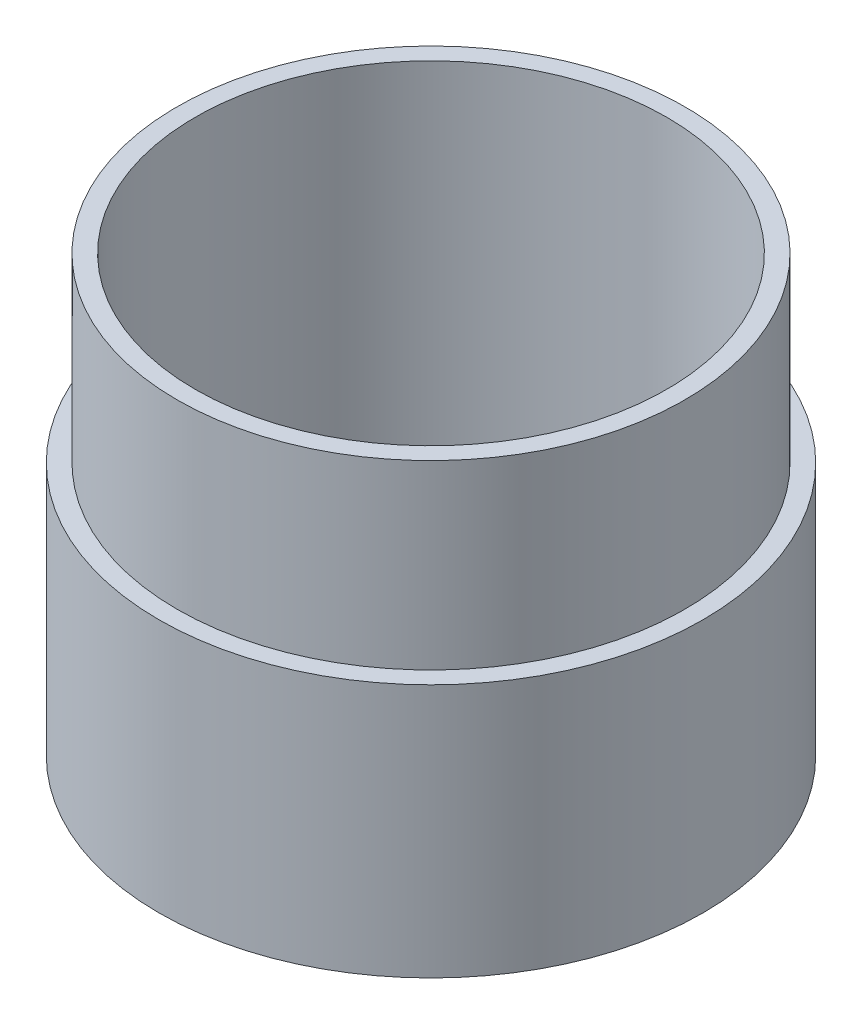
ISO-10303-21;
HEADER;
FILE_DESCRIPTION(('STEP AP214'),'2;1');
FILE_NAME('part.step','',(''),(''),'','','');
FILE_SCHEMA(('AUTOMOTIVE_DESIGN { 1 0 10303 214 1 1 1 1 }'));
ENDSEC;
DATA;
#1=APPLICATION_CONTEXT('core data for automotive mechanical design processes');
#2=APPLICATION_PROTOCOL_DEFINITION('international standard','automotive_design',2000,#1);
#3=PRODUCT_CONTEXT('',#1,'mechanical');
#4=PRODUCT('Part','Part','',(#3));
#5=PRODUCT_RELATED_PRODUCT_CATEGORY('part','',(#4));
#6=PRODUCT_DEFINITION_FORMATION('','',#4);
#7=PRODUCT_DEFINITION_CONTEXT('part definition',#1,'design');
#8=PRODUCT_DEFINITION('design','',#6,#7);
#9=PRODUCT_DEFINITION_SHAPE('','',#8);
#10=(LENGTH_UNIT() NAMED_UNIT(*) SI_UNIT(.MILLI.,.METRE.));
#11=(NAMED_UNIT(*) PLANE_ANGLE_UNIT() SI_UNIT($,.RADIAN.));
#12=(NAMED_UNIT(*) SI_UNIT($,.STERADIAN.) SOLID_ANGLE_UNIT());
#13=UNCERTAINTY_MEASURE_WITH_UNIT(LENGTH_MEASURE(1.E-05),#10,'distance_accuracy_value','');
#14=(GEOMETRIC_REPRESENTATION_CONTEXT(3) GLOBAL_UNCERTAINTY_ASSIGNED_CONTEXT((#13)) GLOBAL_UNIT_ASSIGNED_CONTEXT((#10,
#11,#12)) REPRESENTATION_CONTEXT('',''));
#15=CARTESIAN_POINT('',(0.,0.,0.));
#16=DIRECTION('',(0.,0.,1.));
#17=DIRECTION('',(1.,0.,0.));
#18=AXIS2_PLACEMENT_3D('',#15,#16,#17);
#19=CARTESIAN_POINT('',(0.,35.,0.));
#20=DIRECTION('',(0.,-1.,0.));
#21=DIRECTION('',(0.,0.,-1.));
#22=AXIS2_PLACEMENT_3D('',#19,#20,#21);
#23=CYLINDRICAL_SURFACE('',#22,37.5);
#24=CARTESIAN_POINT('',(0.,35.,0.));
#25=DIRECTION('',(0.,1.,0.));
#26=DIRECTION('',(0.,0.,1.));
#27=AXIS2_PLACEMENT_3D('',#24,#25,#26);
#28=CIRCLE('',#27,37.5);
#29=CARTESIAN_POINT('',(0.,35.,37.5));
#30=VERTEX_POINT('',#29);
#31=EDGE_CURVE('E57',#30,#30,#28,.T.);
#32=ORIENTED_EDGE('',*,*,#31,.F.);
#33=EDGE_LOOP('',(#32));
#34=FACE_BOUND('',#33,.T.);
#35=CARTESIAN_POINT('',(0.,0.,0.));
#36=DIRECTION('',(0.,1.,0.));
#37=DIRECTION('',(0.,0.,1.));
#38=AXIS2_PLACEMENT_3D('',#35,#36,#37);
#39=CIRCLE('',#38,37.5);
#40=CARTESIAN_POINT('',(0.,0.,37.5));
#41=VERTEX_POINT('',#40);
#42=EDGE_CURVE('E52',#41,#41,#39,.T.);
#43=ORIENTED_EDGE('',*,*,#42,.T.);
#44=EDGE_LOOP('',(#43));
#45=FACE_BOUND('',#44,.T.);
#46=ADVANCED_FACE('F49',(#34,#45),#23,.T.);
#47=CARTESIAN_POINT('',(0.,35.,0.));
#48=DIRECTION('',(0.,1.,0.));
#49=DIRECTION('',(0.,0.,1.));
#50=AXIS2_PLACEMENT_3D('',#47,#48,#49);
#51=PLANE('',#50);
#52=CARTESIAN_POINT('',(0.,35.,0.));
#53=DIRECTION('',(0.,1.,0.));
#54=DIRECTION('',(0.,0.,1.));
#55=AXIS2_PLACEMENT_3D('',#52,#53,#54);
#56=CIRCLE('',#55,35.);
#57=CARTESIAN_POINT('',(0.,35.,35.));
#58=VERTEX_POINT('',#57);
#59=EDGE_CURVE('E10',#58,#58,#56,.T.);
#60=ORIENTED_EDGE('',*,*,#59,.F.);
#61=EDGE_LOOP('',(#60));
#62=FACE_BOUND('',#61,.T.);
#63=ORIENTED_EDGE('',*,*,#31,.T.);
#64=EDGE_LOOP('',(#63));
#65=FACE_BOUND('',#64,.T.);
#66=ADVANCED_FACE('F98',(#62,#65),#51,.T.);
#67=CARTESIAN_POINT('',(0.,0.,0.));
#68=DIRECTION('',(0.,1.,0.));
#69=DIRECTION('',(0.,0.,1.));
#70=AXIS2_PLACEMENT_3D('',#67,#68,#69);
#71=PLANE('',#70);
#72=ORIENTED_EDGE('',*,*,#42,.F.);
#73=EDGE_LOOP('',(#72));
#74=FACE_BOUND('',#73,.T.);
#75=ADVANCED_FACE('F93',(#74),#71,.F.);
#76=CARTESIAN_POINT('',(0.,60.,0.));
#77=DIRECTION('',(0.,-1.,0.));
#78=DIRECTION('',(0.,0.,-1.));
#79=AXIS2_PLACEMENT_3D('',#76,#77,#78);
#80=CYLINDRICAL_SURFACE('',#79,35.);
#81=CARTESIAN_POINT('',(0.,60.,0.));
#82=DIRECTION('',(0.,1.,0.));
#83=DIRECTION('',(0.,0.,1.));
#84=AXIS2_PLACEMENT_3D('',#81,#82,#83);
#85=CIRCLE('',#84,35.);
#86=CARTESIAN_POINT('',(0.,60.,35.));
#87=VERTEX_POINT('',#86);
#88=EDGE_CURVE('E64',#87,#87,#85,.T.);
#89=ORIENTED_EDGE('',*,*,#88,.F.);
#90=EDGE_LOOP('',(#89));
#91=FACE_BOUND('',#90,.T.);
#92=ORIENTED_EDGE('',*,*,#59,.T.);
#93=EDGE_LOOP('',(#92));
#94=FACE_BOUND('',#93,.T.);
#95=ADVANCED_FACE('F88',(#91,#94),#80,.T.);
#96=CARTESIAN_POINT('',(0.,60.,0.));
#97=DIRECTION('',(0.,1.,0.));
#98=DIRECTION('',(0.,0.,1.));
#99=AXIS2_PLACEMENT_3D('',#96,#97,#98);
#100=PLANE('',#99);
#101=CARTESIAN_POINT('',(0.,60.,0.));
#102=DIRECTION('',(0.,1.,0.));
#103=DIRECTION('',(0.,0.,1.));
#104=AXIS2_PLACEMENT_3D('',#101,#102,#103);
#105=CIRCLE('',#104,32.5);
#106=CARTESIAN_POINT('',(0.,60.,32.5));
#107=VERTEX_POINT('',#106);
#108=EDGE_CURVE('E69',#107,#107,#105,.T.);
#109=ORIENTED_EDGE('',*,*,#108,.F.);
#110=EDGE_LOOP('',(#109));
#111=FACE_BOUND('',#110,.T.);
#112=ORIENTED_EDGE('',*,*,#88,.T.);
#113=EDGE_LOOP('',(#112));
#114=FACE_BOUND('',#113,.T.);
#115=ADVANCED_FACE('F82',(#111,#114),#100,.T.);
#116=CARTESIAN_POINT('',(0.,1.00000000000001,0.));
#117=DIRECTION('',(0.,1.,0.));
#118=DIRECTION('',(0.,0.,1.));
#119=AXIS2_PLACEMENT_3D('',#116,#117,#118);
#120=CYLINDRICAL_SURFACE('',#119,32.5);
#121=CARTESIAN_POINT('',(0.,1.00000000000001,0.));
#122=DIRECTION('',(0.,1.,0.));
#123=DIRECTION('',(0.,0.,1.));
#124=AXIS2_PLACEMENT_3D('',#121,#122,#123);
#125=CIRCLE('',#124,32.5);
#126=CARTESIAN_POINT('',(0.,1.00000000000001,32.5));
#127=VERTEX_POINT('',#126);
#128=EDGE_CURVE('E68',#127,#127,#125,.T.);
#129=ORIENTED_EDGE('',*,*,#128,.F.);
#130=EDGE_LOOP('',(#129));
#131=FACE_BOUND('',#130,.T.);
#132=ORIENTED_EDGE('',*,*,#108,.T.);
#133=EDGE_LOOP('',(#132));
#134=FACE_BOUND('',#133,.T.);
#135=ADVANCED_FACE('F79',(#131,#134),#120,.F.);
#136=CARTESIAN_POINT('',(0.,1.00000000000001,0.));
#137=DIRECTION('',(0.,1.,0.));
#138=DIRECTION('',(0.,0.,1.));
#139=AXIS2_PLACEMENT_3D('',#136,#137,#138);
#140=PLANE('',#139);
#141=ORIENTED_EDGE('',*,*,#128,.T.);
#142=EDGE_LOOP('',(#141));
#143=FACE_BOUND('',#142,.T.);
#144=ADVANCED_FACE('F77',(#143),#140,.T.);
#145=CLOSED_SHELL('',(#46,#66,#75,#95,#115,#135,#144));
#146=MANIFOLD_SOLID_BREP('B2',#145);
#147=ADVANCED_BREP_SHAPE_REPRESENTATION('',(#18,#146),#14);
#148=SHAPE_DEFINITION_REPRESENTATION(#9,#147);
ENDSEC;
END-ISO-10303-21;
